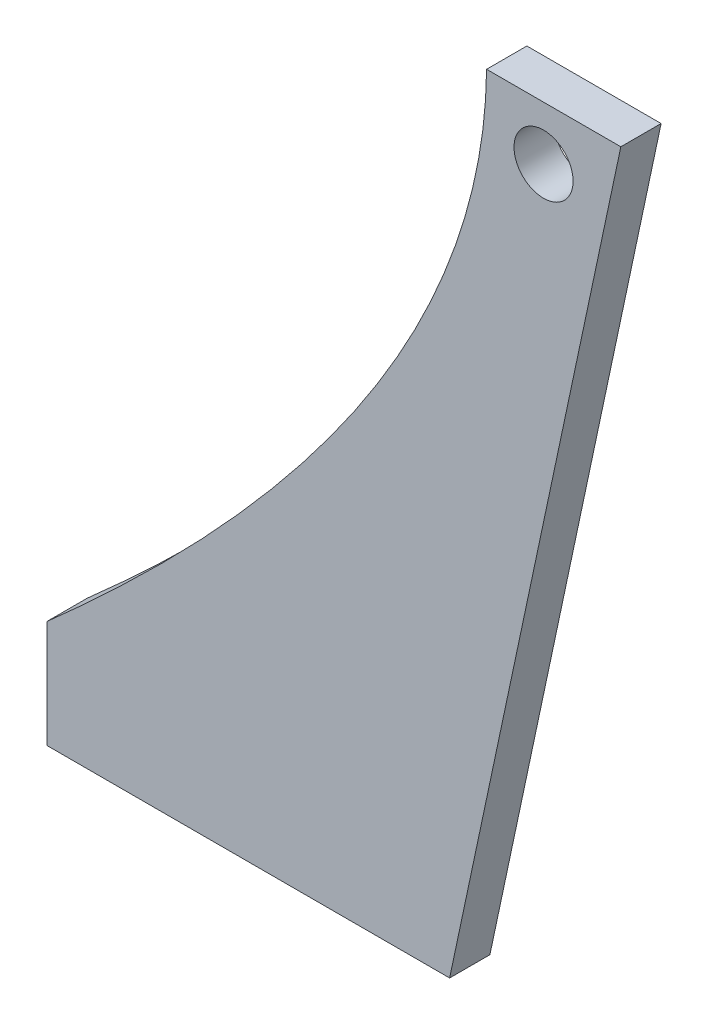
ISO-10303-21;
HEADER;
FILE_DESCRIPTION(('STEP AP214'),'2;1');
FILE_NAME('part.step','',(''),(''),'','','');
FILE_SCHEMA(('AUTOMOTIVE_DESIGN { 1 0 10303 214 1 1 1 1 }'));
ENDSEC;
DATA;
#1=APPLICATION_CONTEXT('core data for automotive mechanical design processes');
#2=APPLICATION_PROTOCOL_DEFINITION('international standard','automotive_design',2000,#1);
#3=PRODUCT_CONTEXT('',#1,'mechanical');
#4=PRODUCT('Part','Part','',(#3));
#5=PRODUCT_RELATED_PRODUCT_CATEGORY('part','',(#4));
#6=PRODUCT_DEFINITION_FORMATION('','',#4);
#7=PRODUCT_DEFINITION_CONTEXT('part definition',#1,'design');
#8=PRODUCT_DEFINITION('design','',#6,#7);
#9=PRODUCT_DEFINITION_SHAPE('','',#8);
#10=(LENGTH_UNIT() NAMED_UNIT(*) SI_UNIT(.MILLI.,.METRE.));
#11=(NAMED_UNIT(*) PLANE_ANGLE_UNIT() SI_UNIT($,.RADIAN.));
#12=(NAMED_UNIT(*) SI_UNIT($,.STERADIAN.) SOLID_ANGLE_UNIT());
#13=UNCERTAINTY_MEASURE_WITH_UNIT(LENGTH_MEASURE(1.E-05),#10,'distance_accuracy_value','');
#14=(GEOMETRIC_REPRESENTATION_CONTEXT(3) GLOBAL_UNCERTAINTY_ASSIGNED_CONTEXT((#13)) GLOBAL_UNIT_ASSIGNED_CONTEXT((#10,
#11,#12)) REPRESENTATION_CONTEXT('',''));
#15=CARTESIAN_POINT('',(0.,0.,0.));
#16=DIRECTION('',(0.,0.,1.));
#17=DIRECTION('',(1.,0.,0.));
#18=AXIS2_PLACEMENT_3D('',#15,#16,#17);
#19=CARTESIAN_POINT('',(0.,40.,-15.));
#20=DIRECTION('',(-1.,0.,0.));
#21=DIRECTION('',(0.,-1.,0.));
#22=AXIS2_PLACEMENT_3D('',#19,#20,#21);
#23=PLANE('',#22);
#24=DIRECTION('',(0.,-1.,0.));
#25=VECTOR('',#24,1.);
#26=CARTESIAN_POINT('',(0.,40.,0.));
#27=LINE('',#26,#25);
#28=CARTESIAN_POINT('',(-8.48769571927895E-13,39.9999999999993,0.));
#29=VERTEX_POINT('',#28);
#30=CARTESIAN_POINT('',(0.,0.,0.));
#31=VERTEX_POINT('',#30);
#32=EDGE_CURVE('E125',#29,#31,#27,.T.);
#33=ORIENTED_EDGE('',*,*,#32,.F.);
#34=DIRECTION('',(0.,0.,1.));
#35=VECTOR('',#34,1.);
#36=CARTESIAN_POINT('',(-8.48769571927895E-13,39.9999999999993,-15.));
#37=LINE('',#36,#35);
#38=CARTESIAN_POINT('',(-8.48769571927895E-13,39.9999999999993,-15.));
#39=VERTEX_POINT('',#38);
#40=EDGE_CURVE('E11',#39,#29,#37,.T.);
#41=ORIENTED_EDGE('',*,*,#40,.F.);
#42=DIRECTION('',(0.,-1.,0.));
#43=VECTOR('',#42,1.);
#44=CARTESIAN_POINT('',(0.,40.,-15.));
#45=LINE('',#44,#43);
#46=CARTESIAN_POINT('',(0.,0.,-15.));
#47=VERTEX_POINT('',#46);
#48=EDGE_CURVE('E116',#39,#47,#45,.T.);
#49=ORIENTED_EDGE('',*,*,#48,.T.);
#50=DIRECTION('',(0.,0.,1.));
#51=VECTOR('',#50,1.);
#52=CARTESIAN_POINT('',(0.,0.,-15.));
#53=LINE('',#52,#51);
#54=EDGE_CURVE('E42',#47,#31,#53,.T.);
#55=ORIENTED_EDGE('',*,*,#54,.T.);
#56=EDGE_LOOP('',(#33,#41,#49,#55));
#57=FACE_BOUND('',#56,.T.);
#58=ADVANCED_FACE('F39',(#57),#23,.T.);
#59=CARTESIAN_POINT('',(163.766968501006,300.,-15.));
#60=CARTESIAN_POINT('',(162.66035437693,183.82854537616,-15.));
#61=CARTESIAN_POINT('',(-8.48769571927895E-13,39.9999999999993,-15.));
#62=B_SPLINE_CURVE_WITH_KNOTS('',2,(#59,#60,#61),.UNSPECIFIED.,.F.,.F.,(3,3),(0.,
0.298724745395367),.UNSPECIFIED.);
#63=DIRECTION('',(0.,0.,1.));
#64=VECTOR('',#63,1.);
#65=SURFACE_OF_LINEAR_EXTRUSION('',#62,#64);
#66=CARTESIAN_POINT('',(163.766968501006,300.,0.));
#67=CARTESIAN_POINT('',(162.66035437693,183.82854537616,0.));
#68=CARTESIAN_POINT('',(-8.48769571927895E-13,39.9999999999993,0.));
#69=B_SPLINE_CURVE_WITH_KNOTS('',2,(#66,#67,#68),.UNSPECIFIED.,.F.,.F.,(3,3),(0.,
0.298724745395367),.UNSPECIFIED.);
#70=CARTESIAN_POINT('',(163.766968501006,300.,0.));
#71=VERTEX_POINT('',#70);
#72=EDGE_CURVE('E156',#71,#29,#69,.T.);
#73=ORIENTED_EDGE('',*,*,#72,.F.);
#74=DIRECTION('',(0.,0.,1.));
#75=VECTOR('',#74,1.);
#76=CARTESIAN_POINT('',(163.766968501006,300.,-15.));
#77=LINE('',#76,#75);
#78=CARTESIAN_POINT('',(163.766968501006,300.,-15.));
#79=VERTEX_POINT('',#78);
#80=EDGE_CURVE('E49',#79,#71,#77,.T.);
#81=ORIENTED_EDGE('',*,*,#80,.F.);
#82=EDGE_CURVE('E108',#79,#39,#62,.T.);
#83=ORIENTED_EDGE('',*,*,#82,.T.);
#84=ORIENTED_EDGE('',*,*,#40,.T.);
#85=EDGE_LOOP('',(#73,#81,#83,#84));
#86=FACE_BOUND('',#85,.T.);
#87=ADVANCED_FACE('F131',(#86),#65,.T.);
#88=CARTESIAN_POINT('',(213.766968501006,300.,-15.));
#89=DIRECTION('',(0.,1.,0.));
#90=DIRECTION('',(-1.,0.,0.));
#91=AXIS2_PLACEMENT_3D('',#88,#89,#90);
#92=PLANE('',#91);
#93=DIRECTION('',(-1.,0.,0.));
#94=VECTOR('',#93,1.);
#95=CARTESIAN_POINT('',(213.766968501006,300.,0.));
#96=LINE('',#95,#94);
#97=CARTESIAN_POINT('',(213.766968501006,300.,0.));
#98=VERTEX_POINT('',#97);
#99=EDGE_CURVE('E96',#98,#71,#96,.T.);
#100=ORIENTED_EDGE('',*,*,#99,.F.);
#101=DIRECTION('',(0.,0.,1.));
#102=VECTOR('',#101,1.);
#103=CARTESIAN_POINT('',(213.766968501006,300.,-15.));
#104=LINE('',#103,#102);
#105=CARTESIAN_POINT('',(213.766968501006,300.,-15.));
#106=VERTEX_POINT('',#105);
#107=EDGE_CURVE('E91',#106,#98,#104,.T.);
#108=ORIENTED_EDGE('',*,*,#107,.F.);
#109=DIRECTION('',(-1.,0.,0.));
#110=VECTOR('',#109,1.);
#111=CARTESIAN_POINT('',(213.766968501006,300.,-15.));
#112=LINE('',#111,#110);
#113=EDGE_CURVE('E94',#106,#79,#112,.T.);
#114=ORIENTED_EDGE('',*,*,#113,.T.);
#115=ORIENTED_EDGE('',*,*,#80,.T.);
#116=EDGE_LOOP('',(#100,#108,#114,#115));
#117=FACE_BOUND('',#116,.T.);
#118=ADVANCED_FACE('F93',(#117),#92,.T.);
#119=CARTESIAN_POINT('',(150.,0.,-15.));
#120=DIRECTION('',(0.978147600733806,-0.207911690817756,0.));
#121=DIRECTION('',(0.207911690817756,0.978147600733806,0.));
#122=AXIS2_PLACEMENT_3D('',#119,#120,#121);
#123=PLANE('',#122);
#124=DIRECTION('',(0.207911690817756,0.978147600733806,0.));
#125=VECTOR('',#124,1.);
#126=CARTESIAN_POINT('',(150.,0.,0.));
#127=LINE('',#126,#125);
#128=CARTESIAN_POINT('',(150.,0.,0.));
#129=VERTEX_POINT('',#128);
#130=EDGE_CURVE('E161',#129,#98,#127,.T.);
#131=ORIENTED_EDGE('',*,*,#130,.F.);
#132=DIRECTION('',(0.,0.,1.));
#133=VECTOR('',#132,1.);
#134=CARTESIAN_POINT('',(150.,0.,-15.));
#135=LINE('',#134,#133);
#136=CARTESIAN_POINT('',(150.,0.,-15.));
#137=VERTEX_POINT('',#136);
#138=EDGE_CURVE('E102',#137,#129,#135,.T.);
#139=ORIENTED_EDGE('',*,*,#138,.F.);
#140=DIRECTION('',(0.207911690817756,0.978147600733806,0.));
#141=VECTOR('',#140,1.);
#142=CARTESIAN_POINT('',(150.,0.,-15.));
#143=LINE('',#142,#141);
#144=EDGE_CURVE('E107',#137,#106,#143,.T.);
#145=ORIENTED_EDGE('',*,*,#144,.T.);
#146=ORIENTED_EDGE('',*,*,#107,.T.);
#147=EDGE_LOOP('',(#131,#139,#145,#146));
#148=FACE_BOUND('',#147,.T.);
#149=ADVANCED_FACE('F111',(#148),#123,.T.);
#150=CARTESIAN_POINT('',(0.,0.,-15.));
#151=DIRECTION('',(0.,-1.,0.));
#152=DIRECTION('',(0.,0.,-1.));
#153=AXIS2_PLACEMENT_3D('',#150,#151,#152);
#154=PLANE('',#153);
#155=DIRECTION('',(1.,0.,0.));
#156=VECTOR('',#155,1.);
#157=CARTESIAN_POINT('',(0.,0.,0.));
#158=LINE('',#157,#156);
#159=EDGE_CURVE('E154',#31,#129,#158,.T.);
#160=ORIENTED_EDGE('',*,*,#159,.F.);
#161=ORIENTED_EDGE('',*,*,#54,.F.);
#162=DIRECTION('',(1.,0.,0.));
#163=VECTOR('',#162,1.);
#164=CARTESIAN_POINT('',(0.,0.,-15.));
#165=LINE('',#164,#163);
#166=EDGE_CURVE('E113',#47,#137,#165,.T.);
#167=ORIENTED_EDGE('',*,*,#166,.T.);
#168=ORIENTED_EDGE('',*,*,#138,.T.);
#169=EDGE_LOOP('',(#160,#161,#167,#168));
#170=FACE_BOUND('',#169,.T.);
#171=ADVANCED_FACE('F140',(#170),#154,.T.);
#172=CARTESIAN_POINT('',(122.271919313716,176.91427268808,-15.));
#173=DIRECTION('',(0.,0.,1.));
#174=DIRECTION('',(1.,0.,0.));
#175=AXIS2_PLACEMENT_3D('',#172,#173,#174);
#176=PLANE('',#175);
#177=CARTESIAN_POINT('',(184.979662990844,280.,-15.));
#178=DIRECTION('',(0.,0.,1.));
#179=DIRECTION('',(1.,0.,0.));
#180=AXIS2_PLACEMENT_3D('',#177,#178,#179);
#181=CIRCLE('',#180,11.);
#182=CARTESIAN_POINT('',(195.979662990845,280.,-15.));
#183=VERTEX_POINT('',#182);
#184=EDGE_CURVE('E155',#183,#183,#181,.T.);
#185=ORIENTED_EDGE('',*,*,#184,.T.);
#186=EDGE_LOOP('',(#185));
#187=FACE_BOUND('',#186,.T.);
#188=ORIENTED_EDGE('',*,*,#48,.F.);
#189=ORIENTED_EDGE('',*,*,#82,.F.);
#190=ORIENTED_EDGE('',*,*,#113,.F.);
#191=ORIENTED_EDGE('',*,*,#144,.F.);
#192=ORIENTED_EDGE('',*,*,#166,.F.);
#193=EDGE_LOOP('',(#188,#189,#190,#191,#192));
#194=FACE_BOUND('',#193,.T.);
#195=ADVANCED_FACE('F106',(#187,#194),#176,.F.);
#196=CARTESIAN_POINT('',(122.271919313716,176.91427268808,0.));
#197=DIRECTION('',(0.,0.,1.));
#198=DIRECTION('',(1.,0.,0.));
#199=AXIS2_PLACEMENT_3D('',#196,#197,#198);
#200=PLANE('',#199);
#201=CARTESIAN_POINT('',(184.979662990844,280.,0.));
#202=DIRECTION('',(0.,0.,1.));
#203=DIRECTION('',(1.,0.,0.));
#204=AXIS2_PLACEMENT_3D('',#201,#202,#203);
#205=CIRCLE('',#204,11.);
#206=CARTESIAN_POINT('',(195.979662990845,280.,0.));
#207=VERTEX_POINT('',#206);
#208=EDGE_CURVE('E178',#207,#207,#205,.T.);
#209=ORIENTED_EDGE('',*,*,#208,.F.);
#210=EDGE_LOOP('',(#209));
#211=FACE_BOUND('',#210,.T.);
#212=ORIENTED_EDGE('',*,*,#32,.T.);
#213=ORIENTED_EDGE('',*,*,#159,.T.);
#214=ORIENTED_EDGE('',*,*,#130,.T.);
#215=ORIENTED_EDGE('',*,*,#99,.T.);
#216=ORIENTED_EDGE('',*,*,#72,.T.);
#217=EDGE_LOOP('',(#212,#213,#214,#215,#216));
#218=FACE_BOUND('',#217,.T.);
#219=ADVANCED_FACE('F135',(#211,#218),#200,.T.);
#220=CARTESIAN_POINT('',(184.979662990844,280.,-15.));
#221=DIRECTION('',(0.,0.,1.));
#222=DIRECTION('',(1.,0.,0.));
#223=AXIS2_PLACEMENT_3D('',#220,#221,#222);
#224=CYLINDRICAL_SURFACE('',#223,11.);
#225=ORIENTED_EDGE('',*,*,#184,.F.);
#226=EDGE_LOOP('',(#225));
#227=FACE_BOUND('',#226,.T.);
#228=ORIENTED_EDGE('',*,*,#208,.T.);
#229=EDGE_LOOP('',(#228));
#230=FACE_BOUND('',#229,.T.);
#231=ADVANCED_FACE('F184',(#227,#230),#224,.F.);
#232=CLOSED_SHELL('',(#58,#87,#118,#149,#171,#195,#219,#231));
#233=MANIFOLD_SOLID_BREP('B2',#232);
#234=ADVANCED_BREP_SHAPE_REPRESENTATION('',(#18,#233),#14);
#235=SHAPE_DEFINITION_REPRESENTATION(#9,#234);
ENDSEC;
END-ISO-10303-21;
